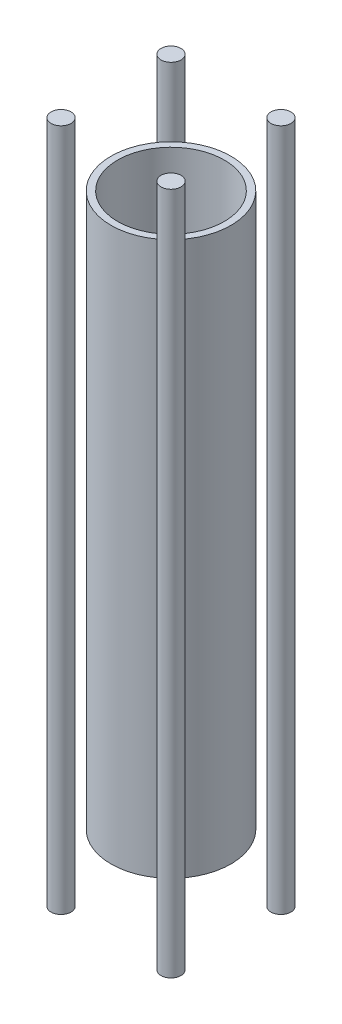
ISO-10303-21;
HEADER;
FILE_DESCRIPTION(('STEP AP214'),'2;1');
FILE_NAME('part.step','',(''),(''),'','','');
FILE_SCHEMA(('AUTOMOTIVE_DESIGN { 1 0 10303 214 1 1 1 1 }'));
ENDSEC;
DATA;
#1=APPLICATION_CONTEXT('core data for automotive mechanical design processes');
#2=APPLICATION_PROTOCOL_DEFINITION('international standard','automotive_design',2000,#1);
#3=PRODUCT_CONTEXT('',#1,'mechanical');
#4=PRODUCT('Part','Part','',(#3));
#5=PRODUCT_RELATED_PRODUCT_CATEGORY('part','',(#4));
#6=PRODUCT_DEFINITION_FORMATION('','',#4);
#7=PRODUCT_DEFINITION_CONTEXT('part definition',#1,'design');
#8=PRODUCT_DEFINITION('design','',#6,#7);
#9=PRODUCT_DEFINITION_SHAPE('','',#8);
#10=(LENGTH_UNIT() NAMED_UNIT(*) SI_UNIT(.MILLI.,.METRE.));
#11=(NAMED_UNIT(*) PLANE_ANGLE_UNIT() SI_UNIT($,.RADIAN.));
#12=(NAMED_UNIT(*) SI_UNIT($,.STERADIAN.) SOLID_ANGLE_UNIT());
#13=UNCERTAINTY_MEASURE_WITH_UNIT(LENGTH_MEASURE(1.E-05),#10,'distance_accuracy_value','');
#14=(GEOMETRIC_REPRESENTATION_CONTEXT(3) GLOBAL_UNCERTAINTY_ASSIGNED_CONTEXT((#13)) GLOBAL_UNIT_ASSIGNED_CONTEXT((#10,
#11,#12)) REPRESENTATION_CONTEXT('',''));
#15=CARTESIAN_POINT('',(0.,0.,0.));
#16=DIRECTION('',(0.,0.,1.));
#17=DIRECTION('',(1.,0.,0.));
#18=AXIS2_PLACEMENT_3D('',#15,#16,#17);
#19=CARTESIAN_POINT('',(-16.5000000000001,-20.,16.4999999999999));
#20=DIRECTION('',(0.,1.,0.));
#21=DIRECTION('',(0.,0.,1.));
#22=AXIS2_PLACEMENT_3D('',#19,#20,#21);
#23=CYLINDRICAL_SURFACE('',#22,3.);
#24=CARTESIAN_POINT('',(-16.5000000000001,-20.,16.4999999999999));
#25=DIRECTION('',(0.,1.,0.));
#26=DIRECTION('',(0.,0.,1.));
#27=AXIS2_PLACEMENT_3D('',#24,#25,#26);
#28=CIRCLE('',#27,3.);
#29=CARTESIAN_POINT('',(-16.5000000000001,-20.,19.4999999999999));
#30=VERTEX_POINT('',#29);
#31=EDGE_CURVE('E11',#30,#30,#28,.T.);
#32=ORIENTED_EDGE('',*,*,#31,.T.);
#33=EDGE_LOOP('',(#32));
#34=FACE_BOUND('',#33,.T.);
#35=CARTESIAN_POINT('',(-16.5000000000001,185.,16.4999999999999));
#36=DIRECTION('',(0.,1.,0.));
#37=DIRECTION('',(0.,0.,1.));
#38=AXIS2_PLACEMENT_3D('',#35,#36,#37);
#39=CIRCLE('',#38,3.);
#40=CARTESIAN_POINT('',(-16.5000000000001,185.,19.4999999999999));
#41=VERTEX_POINT('',#40);
#42=EDGE_CURVE('E47',#41,#41,#39,.T.);
#43=ORIENTED_EDGE('',*,*,#42,.F.);
#44=EDGE_LOOP('',(#43));
#45=FACE_BOUND('',#44,.T.);
#46=ADVANCED_FACE('F41',(#34,#45),#23,.T.);
#47=CARTESIAN_POINT('',(-16.5000000000001,-20.,16.4999999999999));
#48=DIRECTION('',(0.,1.,0.));
#49=DIRECTION('',(0.,0.,1.));
#50=AXIS2_PLACEMENT_3D('',#47,#48,#49);
#51=PLANE('',#50);
#52=ORIENTED_EDGE('',*,*,#31,.F.);
#53=EDGE_LOOP('',(#52));
#54=FACE_BOUND('',#53,.T.);
#55=ADVANCED_FACE('F56',(#54),#51,.F.);
#56=CARTESIAN_POINT('',(-16.5000000000001,185.,16.4999999999999));
#57=DIRECTION('',(0.,1.,0.));
#58=DIRECTION('',(0.,0.,1.));
#59=AXIS2_PLACEMENT_3D('',#56,#57,#58);
#60=PLANE('',#59);
#61=ORIENTED_EDGE('',*,*,#42,.T.);
#62=EDGE_LOOP('',(#61));
#63=FACE_BOUND('',#62,.T.);
#64=ADVANCED_FACE('F53',(#63),#60,.T.);
#65=CLOSED_SHELL('',(#46,#55,#64));
#66=MANIFOLD_SOLID_BREP('B2',#65);
#67=CARTESIAN_POINT('',(16.4999999999999,-20.,16.5000000000001));
#68=DIRECTION('',(0.,1.,0.));
#69=DIRECTION('',(0.,0.,1.));
#70=AXIS2_PLACEMENT_3D('',#67,#68,#69);
#71=CYLINDRICAL_SURFACE('',#70,3.);
#72=CARTESIAN_POINT('',(16.4999999999999,-20.,16.5000000000001));
#73=DIRECTION('',(0.,1.,0.));
#74=DIRECTION('',(0.,0.,1.));
#75=AXIS2_PLACEMENT_3D('',#72,#73,#74);
#76=CIRCLE('',#75,3.);
#77=CARTESIAN_POINT('',(16.4999999999999,-20.,19.5000000000001));
#78=VERTEX_POINT('',#77);
#79=EDGE_CURVE('E40',#78,#78,#76,.T.);
#80=ORIENTED_EDGE('',*,*,#79,.T.);
#81=EDGE_LOOP('',(#80));
#82=FACE_BOUND('',#81,.T.);
#83=CARTESIAN_POINT('',(16.4999999999999,185.,16.5000000000001));
#84=DIRECTION('',(0.,1.,0.));
#85=DIRECTION('',(0.,0.,1.));
#86=AXIS2_PLACEMENT_3D('',#83,#84,#85);
#87=CIRCLE('',#86,3.);
#88=CARTESIAN_POINT('',(16.4999999999999,185.,19.5000000000001));
#89=VERTEX_POINT('',#88);
#90=EDGE_CURVE('E95',#89,#89,#87,.T.);
#91=ORIENTED_EDGE('',*,*,#90,.F.);
#92=EDGE_LOOP('',(#91));
#93=FACE_BOUND('',#92,.T.);
#94=ADVANCED_FACE('F89',(#82,#93),#71,.T.);
#95=CARTESIAN_POINT('',(16.4999999999999,-20.,16.5000000000001));
#96=DIRECTION('',(0.,1.,0.));
#97=DIRECTION('',(0.,0.,1.));
#98=AXIS2_PLACEMENT_3D('',#95,#96,#97);
#99=PLANE('',#98);
#100=ORIENTED_EDGE('',*,*,#79,.F.);
#101=EDGE_LOOP('',(#100));
#102=FACE_BOUND('',#101,.T.);
#103=ADVANCED_FACE('F104',(#102),#99,.F.);
#104=CARTESIAN_POINT('',(16.4999999999999,185.,16.5000000000001));
#105=DIRECTION('',(0.,1.,0.));
#106=DIRECTION('',(0.,0.,1.));
#107=AXIS2_PLACEMENT_3D('',#104,#105,#106);
#108=PLANE('',#107);
#109=ORIENTED_EDGE('',*,*,#90,.T.);
#110=EDGE_LOOP('',(#109));
#111=FACE_BOUND('',#110,.T.);
#112=ADVANCED_FACE('F101',(#111),#108,.T.);
#113=CLOSED_SHELL('',(#94,#103,#112));
#114=MANIFOLD_SOLID_BREP('B6',#113);
#115=CARTESIAN_POINT('',(16.5000000000001,-20.,-16.4999999999999));
#116=DIRECTION('',(0.,1.,0.));
#117=DIRECTION('',(0.,0.,1.));
#118=AXIS2_PLACEMENT_3D('',#115,#116,#117);
#119=CYLINDRICAL_SURFACE('',#118,3.);
#120=CARTESIAN_POINT('',(16.5000000000001,-20.,-16.4999999999999));
#121=DIRECTION('',(0.,1.,0.));
#122=DIRECTION('',(0.,0.,1.));
#123=AXIS2_PLACEMENT_3D('',#120,#121,#122);
#124=CIRCLE('',#123,3.);
#125=CARTESIAN_POINT('',(16.5000000000001,-20.,-13.4999999999999));
#126=VERTEX_POINT('',#125);
#127=EDGE_CURVE('E88',#126,#126,#124,.T.);
#128=ORIENTED_EDGE('',*,*,#127,.T.);
#129=EDGE_LOOP('',(#128));
#130=FACE_BOUND('',#129,.T.);
#131=CARTESIAN_POINT('',(16.5000000000001,185.,-16.4999999999999));
#132=DIRECTION('',(0.,1.,0.));
#133=DIRECTION('',(0.,0.,1.));
#134=AXIS2_PLACEMENT_3D('',#131,#132,#133);
#135=CIRCLE('',#134,3.);
#136=CARTESIAN_POINT('',(16.5000000000001,185.,-13.4999999999999));
#137=VERTEX_POINT('',#136);
#138=EDGE_CURVE('E143',#137,#137,#135,.T.);
#139=ORIENTED_EDGE('',*,*,#138,.F.);
#140=EDGE_LOOP('',(#139));
#141=FACE_BOUND('',#140,.T.);
#142=ADVANCED_FACE('F137',(#130,#141),#119,.T.);
#143=CARTESIAN_POINT('',(16.5000000000001,-20.,-16.4999999999999));
#144=DIRECTION('',(0.,1.,0.));
#145=DIRECTION('',(0.,0.,1.));
#146=AXIS2_PLACEMENT_3D('',#143,#144,#145);
#147=PLANE('',#146);
#148=ORIENTED_EDGE('',*,*,#127,.F.);
#149=EDGE_LOOP('',(#148));
#150=FACE_BOUND('',#149,.T.);
#151=ADVANCED_FACE('F152',(#150),#147,.F.);
#152=CARTESIAN_POINT('',(16.5000000000001,185.,-16.4999999999999));
#153=DIRECTION('',(0.,1.,0.));
#154=DIRECTION('',(0.,0.,1.));
#155=AXIS2_PLACEMENT_3D('',#152,#153,#154);
#156=PLANE('',#155);
#157=ORIENTED_EDGE('',*,*,#138,.T.);
#158=EDGE_LOOP('',(#157));
#159=FACE_BOUND('',#158,.T.);
#160=ADVANCED_FACE('F149',(#159),#156,.T.);
#161=CLOSED_SHELL('',(#142,#151,#160));
#162=MANIFOLD_SOLID_BREP('B35',#161);
#163=CARTESIAN_POINT('',(-16.4999999999999,-20.,-16.5000000000001));
#164=DIRECTION('',(0.,1.,0.));
#165=DIRECTION('',(0.,0.,1.));
#166=AXIS2_PLACEMENT_3D('',#163,#164,#165);
#167=CYLINDRICAL_SURFACE('',#166,3.);
#168=CARTESIAN_POINT('',(-16.4999999999999,-20.,-16.5000000000001));
#169=DIRECTION('',(0.,1.,0.));
#170=DIRECTION('',(0.,0.,1.));
#171=AXIS2_PLACEMENT_3D('',#168,#169,#170);
#172=CIRCLE('',#171,3.);
#173=CARTESIAN_POINT('',(-16.4999999999999,-20.,-13.5000000000001));
#174=VERTEX_POINT('',#173);
#175=EDGE_CURVE('E136',#174,#174,#172,.T.);
#176=ORIENTED_EDGE('',*,*,#175,.T.);
#177=EDGE_LOOP('',(#176));
#178=FACE_BOUND('',#177,.T.);
#179=CARTESIAN_POINT('',(-16.4999999999999,185.,-16.5000000000001));
#180=DIRECTION('',(0.,1.,0.));
#181=DIRECTION('',(0.,0.,1.));
#182=AXIS2_PLACEMENT_3D('',#179,#180,#181);
#183=CIRCLE('',#182,3.);
#184=CARTESIAN_POINT('',(-16.4999999999999,185.,-13.5000000000001));
#185=VERTEX_POINT('',#184);
#186=EDGE_CURVE('E190',#185,#185,#183,.T.);
#187=ORIENTED_EDGE('',*,*,#186,.F.);
#188=EDGE_LOOP('',(#187));
#189=FACE_BOUND('',#188,.T.);
#190=ADVANCED_FACE('F184',(#178,#189),#167,.T.);
#191=CARTESIAN_POINT('',(-16.4999999999999,-20.,-16.5000000000001));
#192=DIRECTION('',(0.,1.,0.));
#193=DIRECTION('',(0.,0.,1.));
#194=AXIS2_PLACEMENT_3D('',#191,#192,#193);
#195=PLANE('',#194);
#196=ORIENTED_EDGE('',*,*,#175,.F.);
#197=EDGE_LOOP('',(#196));
#198=FACE_BOUND('',#197,.T.);
#199=ADVANCED_FACE('F199',(#198),#195,.F.);
#200=CARTESIAN_POINT('',(-16.4999999999999,185.,-16.5000000000001));
#201=DIRECTION('',(0.,1.,0.));
#202=DIRECTION('',(0.,0.,1.));
#203=AXIS2_PLACEMENT_3D('',#200,#201,#202);
#204=PLANE('',#203);
#205=ORIENTED_EDGE('',*,*,#186,.T.);
#206=EDGE_LOOP('',(#205));
#207=FACE_BOUND('',#206,.T.);
#208=ADVANCED_FACE('F196',(#207),#204,.T.);
#209=CLOSED_SHELL('',(#190,#199,#208));
#210=MANIFOLD_SOLID_BREP('B83',#209);
#211=CARTESIAN_POINT('',(0.,166.,0.));
#212=DIRECTION('',(0.,1.,0.));
#213=DIRECTION('',(0.,0.,1.));
#214=AXIS2_PLACEMENT_3D('',#211,#212,#213);
#215=PLANE('',#214);
#216=CARTESIAN_POINT('',(0.,166.,0.));
#217=DIRECTION('',(0.,1.,0.));
#218=DIRECTION('',(0.,0.,1.));
#219=AXIS2_PLACEMENT_3D('',#216,#217,#218);
#220=CIRCLE('',#219,18.);
#221=CARTESIAN_POINT('',(0.,166.,18.));
#222=VERTEX_POINT('',#221);
#223=EDGE_CURVE('E183',#222,#222,#220,.T.);
#224=ORIENTED_EDGE('',*,*,#223,.T.);
#225=EDGE_LOOP('',(#224));
#226=FACE_BOUND('',#225,.T.);
#227=CARTESIAN_POINT('',(0.,166.,0.));
#228=DIRECTION('',(0.,1.,0.));
#229=DIRECTION('',(0.,0.,1.));
#230=AXIS2_PLACEMENT_3D('',#227,#228,#229);
#231=CIRCLE('',#230,16.);
#232=CARTESIAN_POINT('',(0.,166.,16.));
#233=VERTEX_POINT('',#232);
#234=EDGE_CURVE('E235',#233,#233,#231,.T.);
#235=ORIENTED_EDGE('',*,*,#234,.F.);
#236=EDGE_LOOP('',(#235));
#237=FACE_BOUND('',#236,.T.);
#238=ADVANCED_FACE('F224',(#226,#237),#215,.T.);
#239=CARTESIAN_POINT('',(0.,0.,0.));
#240=DIRECTION('',(0.,1.,0.));
#241=DIRECTION('',(0.,0.,1.));
#242=AXIS2_PLACEMENT_3D('',#239,#240,#241);
#243=PLANE('',#242);
#244=CARTESIAN_POINT('',(0.,0.,0.));
#245=DIRECTION('',(0.,1.,0.));
#246=DIRECTION('',(0.,0.,1.));
#247=AXIS2_PLACEMENT_3D('',#244,#245,#246);
#248=CIRCLE('',#247,18.);
#249=CARTESIAN_POINT('',(0.,0.,18.));
#250=VERTEX_POINT('',#249);
#251=EDGE_CURVE('E228',#250,#250,#248,.T.);
#252=ORIENTED_EDGE('',*,*,#251,.F.);
#253=EDGE_LOOP('',(#252));
#254=FACE_BOUND('',#253,.T.);
#255=CARTESIAN_POINT('',(0.,0.,0.));
#256=DIRECTION('',(0.,1.,0.));
#257=DIRECTION('',(0.,0.,1.));
#258=AXIS2_PLACEMENT_3D('',#255,#256,#257);
#259=CIRCLE('',#258,16.);
#260=CARTESIAN_POINT('',(0.,0.,16.));
#261=VERTEX_POINT('',#260);
#262=EDGE_CURVE('E237',#261,#261,#259,.T.);
#263=ORIENTED_EDGE('',*,*,#262,.T.);
#264=EDGE_LOOP('',(#263));
#265=FACE_BOUND('',#264,.T.);
#266=ADVANCED_FACE('F247',(#254,#265),#243,.F.);
#267=CARTESIAN_POINT('',(0.,166.,0.));
#268=DIRECTION('',(0.,-1.,0.));
#269=DIRECTION('',(0.,0.,-1.));
#270=AXIS2_PLACEMENT_3D('',#267,#268,#269);
#271=CYLINDRICAL_SURFACE('',#270,18.);
#272=ORIENTED_EDGE('',*,*,#223,.F.);
#273=EDGE_LOOP('',(#272));
#274=FACE_BOUND('',#273,.T.);
#275=ORIENTED_EDGE('',*,*,#251,.T.);
#276=EDGE_LOOP('',(#275));
#277=FACE_BOUND('',#276,.T.);
#278=ADVANCED_FACE('F226',(#274,#277),#271,.T.);
#279=CARTESIAN_POINT('',(0.,166.,0.));
#280=DIRECTION('',(0.,-1.,0.));
#281=DIRECTION('',(0.,0.,-1.));
#282=AXIS2_PLACEMENT_3D('',#279,#280,#281);
#283=CYLINDRICAL_SURFACE('',#282,16.);
#284=ORIENTED_EDGE('',*,*,#234,.T.);
#285=EDGE_LOOP('',(#284));
#286=FACE_BOUND('',#285,.T.);
#287=ORIENTED_EDGE('',*,*,#262,.F.);
#288=EDGE_LOOP('',(#287));
#289=FACE_BOUND('',#288,.T.);
#290=ADVANCED_FACE('F243',(#286,#289),#283,.F.);
#291=CLOSED_SHELL('',(#238,#266,#278,#290));
#292=MANIFOLD_SOLID_BREP('B131',#291);
#293=ADVANCED_BREP_SHAPE_REPRESENTATION('',(#18,#66,#114,#162,#210,#292),#14);
#294=SHAPE_DEFINITION_REPRESENTATION(#9,#293);
ENDSEC;
END-ISO-10303-21;
